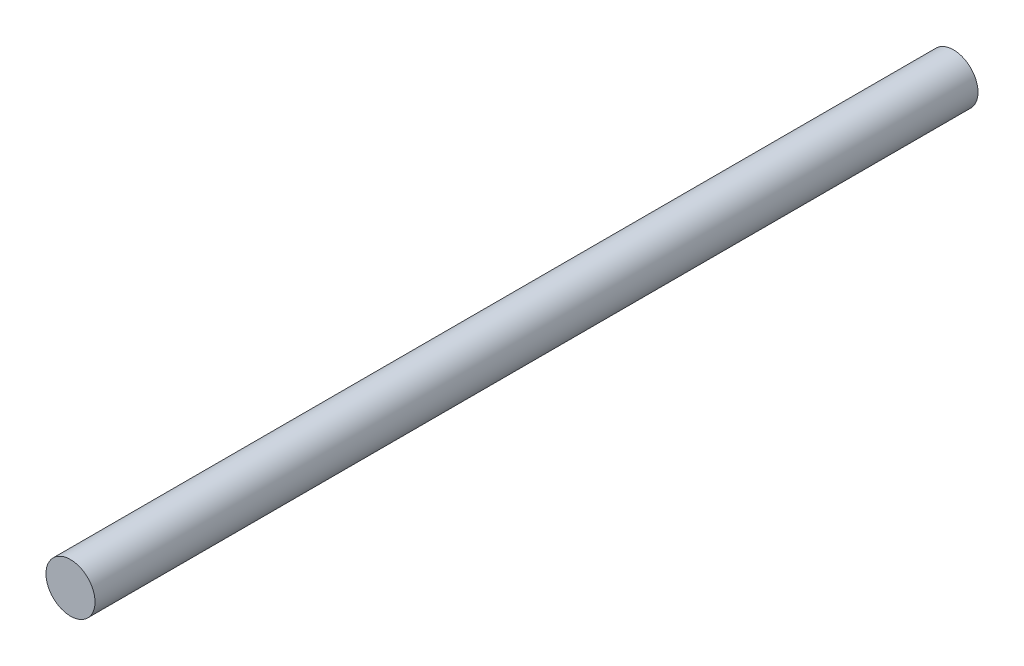
ISO-10303-21;
HEADER;
FILE_DESCRIPTION(('STEP AP214'),'2;1');
FILE_NAME('part.step','',(''),(''),'','','');
FILE_SCHEMA(('AUTOMOTIVE_DESIGN { 1 0 10303 214 1 1 1 1 }'));
ENDSEC;
DATA;
#1=APPLICATION_CONTEXT('core data for automotive mechanical design processes');
#2=APPLICATION_PROTOCOL_DEFINITION('international standard','automotive_design',2000,#1);
#3=PRODUCT_CONTEXT('',#1,'mechanical');
#4=PRODUCT('Part','Part','',(#3));
#5=PRODUCT_RELATED_PRODUCT_CATEGORY('part','',(#4));
#6=PRODUCT_DEFINITION_FORMATION('','',#4);
#7=PRODUCT_DEFINITION_CONTEXT('part definition',#1,'design');
#8=PRODUCT_DEFINITION('design','',#6,#7);
#9=PRODUCT_DEFINITION_SHAPE('','',#8);
#10=(LENGTH_UNIT() NAMED_UNIT(*) SI_UNIT(.MILLI.,.METRE.));
#11=(NAMED_UNIT(*) PLANE_ANGLE_UNIT() SI_UNIT($,.RADIAN.));
#12=(NAMED_UNIT(*) SI_UNIT($,.STERADIAN.) SOLID_ANGLE_UNIT());
#13=UNCERTAINTY_MEASURE_WITH_UNIT(LENGTH_MEASURE(1.E-05),#10,'distance_accuracy_value','');
#14=(GEOMETRIC_REPRESENTATION_CONTEXT(3) GLOBAL_UNCERTAINTY_ASSIGNED_CONTEXT((#13)) GLOBAL_UNIT_ASSIGNED_CONTEXT((#10,
#11,#12)) REPRESENTATION_CONTEXT('',''));
#15=CARTESIAN_POINT('',(0.,0.,0.));
#16=DIRECTION('',(0.,0.,1.));
#17=DIRECTION('',(1.,0.,0.));
#18=AXIS2_PLACEMENT_3D('',#15,#16,#17);
#19=CARTESIAN_POINT('',(-3.15852978845116,11.036558159512,114.3));
#20=DIRECTION('',(0.,0.,-1.));
#21=DIRECTION('',(-1.,0.,0.));
#22=AXIS2_PLACEMENT_3D('',#19,#20,#21);
#23=CYLINDRICAL_SURFACE('',#22,3.175);
#24=CARTESIAN_POINT('',(-3.15852978845116,11.036558159512,114.3));
#25=DIRECTION('',(0.,0.,1.));
#26=DIRECTION('',(1.,0.,0.));
#27=AXIS2_PLACEMENT_3D('',#24,#25,#26);
#28=CIRCLE('',#27,3.175);
#29=CARTESIAN_POINT('',(0.0164702115488442,11.036558159512,114.3));
#30=VERTEX_POINT('',#29);
#31=EDGE_CURVE('E10',#30,#30,#28,.T.);
#32=ORIENTED_EDGE('',*,*,#31,.F.);
#33=EDGE_LOOP('',(#32));
#34=FACE_BOUND('',#33,.T.);
#35=CARTESIAN_POINT('',(-3.15852978845116,11.036558159512,0.));
#36=DIRECTION('',(0.,0.,1.));
#37=DIRECTION('',(1.,0.,0.));
#38=AXIS2_PLACEMENT_3D('',#35,#36,#37);
#39=CIRCLE('',#38,3.175);
#40=CARTESIAN_POINT('',(0.0164702115488442,11.036558159512,0.));
#41=VERTEX_POINT('',#40);
#42=EDGE_CURVE('E34',#41,#41,#39,.T.);
#43=ORIENTED_EDGE('',*,*,#42,.T.);
#44=EDGE_LOOP('',(#43));
#45=FACE_BOUND('',#44,.T.);
#46=ADVANCED_FACE('F31',(#34,#45),#23,.T.);
#47=CARTESIAN_POINT('',(-3.15852978845116,11.036558159512,114.3));
#48=DIRECTION('',(0.,0.,1.));
#49=DIRECTION('',(1.,0.,0.));
#50=AXIS2_PLACEMENT_3D('',#47,#48,#49);
#51=PLANE('',#50);
#52=ORIENTED_EDGE('',*,*,#31,.T.);
#53=EDGE_LOOP('',(#52));
#54=FACE_BOUND('',#53,.T.);
#55=ADVANCED_FACE('F46',(#54),#51,.T.);
#56=CARTESIAN_POINT('',(-3.15852978845116,11.036558159512,0.));
#57=DIRECTION('',(0.,0.,1.));
#58=DIRECTION('',(1.,0.,0.));
#59=AXIS2_PLACEMENT_3D('',#56,#57,#58);
#60=PLANE('',#59);
#61=ORIENTED_EDGE('',*,*,#42,.F.);
#62=EDGE_LOOP('',(#61));
#63=FACE_BOUND('',#62,.T.);
#64=ADVANCED_FACE('F44',(#63),#60,.F.);
#65=CLOSED_SHELL('',(#46,#55,#64));
#66=MANIFOLD_SOLID_BREP('B2',#65);
#67=ADVANCED_BREP_SHAPE_REPRESENTATION('',(#18,#66),#14);
#68=SHAPE_DEFINITION_REPRESENTATION(#9,#67);
ENDSEC;
END-ISO-10303-21;
